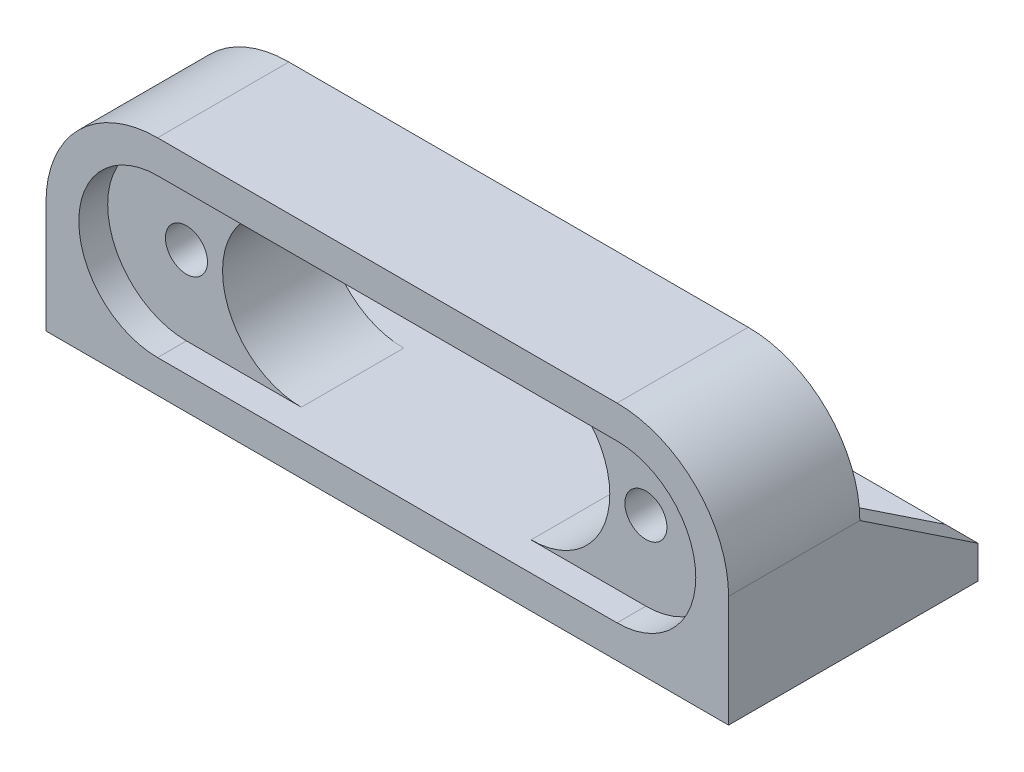
ISO-10303-21;
HEADER;
FILE_DESCRIPTION(('STEP AP214'),'2;1');
FILE_NAME('part.step','',(''),(''),'','','');
FILE_SCHEMA(('AUTOMOTIVE_DESIGN { 1 0 10303 214 1 1 1 1 }'));
ENDSEC;
DATA;
#1=APPLICATION_CONTEXT('core data for automotive mechanical design processes');
#2=APPLICATION_PROTOCOL_DEFINITION('international standard','automotive_design',2000,#1);
#3=PRODUCT_CONTEXT('',#1,'mechanical');
#4=PRODUCT('Part','Part','',(#3));
#5=PRODUCT_RELATED_PRODUCT_CATEGORY('part','',(#4));
#6=PRODUCT_DEFINITION_FORMATION('','',#4);
#7=PRODUCT_DEFINITION_CONTEXT('part definition',#1,'design');
#8=PRODUCT_DEFINITION('design','',#6,#7);
#9=PRODUCT_DEFINITION_SHAPE('','',#8);
#10=(LENGTH_UNIT() NAMED_UNIT(*) SI_UNIT(.MILLI.,.METRE.));
#11=(NAMED_UNIT(*) PLANE_ANGLE_UNIT() SI_UNIT($,.RADIAN.));
#12=(NAMED_UNIT(*) SI_UNIT($,.STERADIAN.) SOLID_ANGLE_UNIT());
#13=UNCERTAINTY_MEASURE_WITH_UNIT(LENGTH_MEASURE(1.E-05),#10,'distance_accuracy_value','');
#14=(GEOMETRIC_REPRESENTATION_CONTEXT(3) GLOBAL_UNCERTAINTY_ASSIGNED_CONTEXT((#13)) GLOBAL_UNIT_ASSIGNED_CONTEXT((#10,
#11,#12)) REPRESENTATION_CONTEXT('',''));
#15=CARTESIAN_POINT('',(0.,0.,0.));
#16=DIRECTION('',(0.,0.,1.));
#17=DIRECTION('',(1.,0.,0.));
#18=AXIS2_PLACEMENT_3D('',#15,#16,#17);
#19=CARTESIAN_POINT('',(-17.5,0.,0.));
#20=DIRECTION('',(0.,0.,1.));
#21=DIRECTION('',(1.,0.,0.));
#22=AXIS2_PLACEMENT_3D('',#19,#20,#21);
#23=PLANE('',#22);
#24=CARTESIAN_POINT('',(17.5,0.,0.));
#25=DIRECTION('',(0.,0.,1.));
#26=DIRECTION('',(1.,0.,0.));
#27=AXIS2_PLACEMENT_3D('',#24,#25,#26);
#28=CIRCLE('',#27,1.6);
#29=CARTESIAN_POINT('',(19.1,0.,0.));
#30=VERTEX_POINT('',#29);
#31=EDGE_CURVE('E260',#30,#30,#28,.T.);
#32=ORIENTED_EDGE('',*,*,#31,.T.);
#33=EDGE_LOOP('',(#32));
#34=FACE_BOUND('',#33,.T.);
#35=CARTESIAN_POINT('',(-17.5,0.,0.));
#36=DIRECTION('',(0.,0.,1.));
#37=DIRECTION('',(1.,0.,0.));
#38=AXIS2_PLACEMENT_3D('',#35,#36,#37);
#39=CIRCLE('',#38,1.6);
#40=CARTESIAN_POINT('',(-15.9,0.,0.));
#41=VERTEX_POINT('',#40);
#42=EDGE_CURVE('E256',#41,#41,#39,.T.);
#43=ORIENTED_EDGE('',*,*,#42,.T.);
#44=EDGE_LOOP('',(#43));
#45=FACE_BOUND('',#44,.T.);
#46=DIRECTION('',(1.,0.,0.));
#47=VECTOR('',#46,1.);
#48=CARTESIAN_POINT('',(26.,0.,0.));
#49=LINE('',#48,#47);
#50=CARTESIAN_POINT('',(23.5,0.,0.));
#51=VERTEX_POINT('',#50);
#52=CARTESIAN_POINT('',(26.,0.,0.));
#53=VERTEX_POINT('',#52);
#54=EDGE_CURVE('E189',#51,#53,#49,.T.);
#55=ORIENTED_EDGE('',*,*,#54,.F.);
#56=DIRECTION('',(0.,1.,0.));
#57=VECTOR('',#56,1.);
#58=CARTESIAN_POINT('',(23.5,0.,0.));
#59=LINE('',#58,#57);
#60=CARTESIAN_POINT('',(23.5,-6.,0.));
#61=VERTEX_POINT('',#60);
#62=EDGE_CURVE('E354',#61,#51,#59,.T.);
#63=ORIENTED_EDGE('',*,*,#62,.F.);
#64=DIRECTION('',(1.,0.,0.));
#65=VECTOR('',#64,1.);
#66=CARTESIAN_POINT('',(8.74999999999994,-6.,0.));
#67=LINE('',#66,#65);
#68=CARTESIAN_POINT('',(8.75,-6.,0.));
#69=VERTEX_POINT('',#68);
#70=EDGE_CURVE('E52',#69,#61,#67,.T.);
#71=ORIENTED_EDGE('',*,*,#70,.F.);
#72=CARTESIAN_POINT('',(8.75,0.,0.));
#73=DIRECTION('',(0.,0.,1.));
#74=DIRECTION('',(1.,0.,0.));
#75=AXIS2_PLACEMENT_3D('',#72,#73,#74);
#76=CIRCLE('',#75,6.);
#77=CARTESIAN_POINT('',(8.75,6.,0.));
#78=VERTEX_POINT('',#77);
#79=EDGE_CURVE('E275',#69,#78,#76,.T.);
#80=ORIENTED_EDGE('',*,*,#79,.T.);
#81=DIRECTION('',(-1.,0.,0.));
#82=VECTOR('',#81,1.);
#83=CARTESIAN_POINT('',(0.,6.,0.));
#84=LINE('',#83,#82);
#85=CARTESIAN_POINT('',(-8.75,6.,0.));
#86=VERTEX_POINT('',#85);
#87=EDGE_CURVE('E269',#78,#86,#84,.T.);
#88=ORIENTED_EDGE('',*,*,#87,.T.);
#89=CARTESIAN_POINT('',(-8.75,0.,0.));
#90=DIRECTION('',(0.,0.,1.));
#91=DIRECTION('',(1.,0.,0.));
#92=AXIS2_PLACEMENT_3D('',#89,#90,#91);
#93=CIRCLE('',#92,6.);
#94=CARTESIAN_POINT('',(-8.75,-6.,0.));
#95=VERTEX_POINT('',#94);
#96=EDGE_CURVE('E264',#86,#95,#93,.T.);
#97=ORIENTED_EDGE('',*,*,#96,.T.);
#98=CARTESIAN_POINT('',(-23.5,-6.,0.));
#99=VERTEX_POINT('',#98);
#100=EDGE_CURVE('E66',#99,#95,#67,.T.);
#101=ORIENTED_EDGE('',*,*,#100,.F.);
#102=DIRECTION('',(0.,-1.,0.));
#103=VECTOR('',#102,1.);
#104=CARTESIAN_POINT('',(-23.5,0.,0.));
#105=LINE('',#104,#103);
#106=CARTESIAN_POINT('',(-23.5,0.,0.));
#107=VERTEX_POINT('',#106);
#108=EDGE_CURVE('E187',#107,#99,#105,.T.);
#109=ORIENTED_EDGE('',*,*,#108,.F.);
#110=DIRECTION('',(1.,0.,0.));
#111=VECTOR('',#110,1.);
#112=CARTESIAN_POINT('',(-26.,0.,0.));
#113=LINE('',#112,#111);
#114=CARTESIAN_POINT('',(-26.,0.,0.));
#115=VERTEX_POINT('',#114);
#116=EDGE_CURVE('E171',#115,#107,#113,.T.);
#117=ORIENTED_EDGE('',*,*,#116,.F.);
#118=CARTESIAN_POINT('',(-17.5,0.,0.));
#119=DIRECTION('',(0.,0.,1.));
#120=DIRECTION('',(1.,0.,0.));
#121=AXIS2_PLACEMENT_3D('',#118,#119,#120);
#122=CIRCLE('',#121,8.5);
#123=CARTESIAN_POINT('',(-17.5,8.5,0.));
#124=VERTEX_POINT('',#123);
#125=EDGE_CURVE('E185',#124,#115,#122,.T.);
#126=ORIENTED_EDGE('',*,*,#125,.F.);
#127=DIRECTION('',(-1.,0.,0.));
#128=VECTOR('',#127,1.);
#129=CARTESIAN_POINT('',(0.,8.5,0.));
#130=LINE('',#129,#128);
#131=CARTESIAN_POINT('',(17.5,8.5,0.));
#132=VERTEX_POINT('',#131);
#133=EDGE_CURVE('E299',#132,#124,#130,.T.);
#134=ORIENTED_EDGE('',*,*,#133,.F.);
#135=CARTESIAN_POINT('',(17.5,0.,0.));
#136=DIRECTION('',(0.,0.,1.));
#137=DIRECTION('',(1.,0.,0.));
#138=AXIS2_PLACEMENT_3D('',#135,#136,#137);
#139=CIRCLE('',#138,8.5);
#140=EDGE_CURVE('E198',#53,#132,#139,.T.);
#141=ORIENTED_EDGE('',*,*,#140,.F.);
#142=EDGE_LOOP('',(#55,#63,#71,#80,#88,#97,#101,#109,#117,#126,#134,#141));
#143=FACE_BOUND('',#142,.T.);
#144=ADVANCED_FACE('F43',(#34,#45,#143),#23,.F.);
#145=CARTESIAN_POINT('',(-8.75,0.,10.));
#146=DIRECTION('',(0.,0.,-1.));
#147=DIRECTION('',(-1.,0.,0.));
#148=AXIS2_PLACEMENT_3D('',#145,#146,#147);
#149=CYLINDRICAL_SURFACE('',#148,6.);
#150=DIRECTION('',(0.,0.,-1.));
#151=VECTOR('',#150,1.);
#152=CARTESIAN_POINT('',(-8.75,6.,10.));
#153=LINE('',#152,#151);
#154=CARTESIAN_POINT('',(-8.75,6.,7.8));
#155=VERTEX_POINT('',#154);
#156=EDGE_CURVE('E199',#155,#86,#153,.T.);
#157=ORIENTED_EDGE('',*,*,#156,.F.);
#158=CARTESIAN_POINT('',(-8.75,0.,7.8));
#159=DIRECTION('',(0.,0.,1.));
#160=DIRECTION('',(1.,0.,0.));
#161=AXIS2_PLACEMENT_3D('',#158,#159,#160);
#162=CIRCLE('',#161,6.);
#163=CARTESIAN_POINT('',(-8.75,-6.,7.8));
#164=VERTEX_POINT('',#163);
#165=EDGE_CURVE('E252',#155,#164,#162,.T.);
#166=ORIENTED_EDGE('',*,*,#165,.T.);
#167=DIRECTION('',(0.,0.,-1.));
#168=VECTOR('',#167,1.);
#169=CARTESIAN_POINT('',(-8.75,-6.,10.));
#170=LINE('',#169,#168);
#171=EDGE_CURVE('E288',#164,#95,#170,.T.);
#172=ORIENTED_EDGE('',*,*,#171,.T.);
#173=ORIENTED_EDGE('',*,*,#96,.F.);
#174=EDGE_LOOP('',(#157,#166,#172,#173));
#175=FACE_BOUND('',#174,.T.);
#176=ADVANCED_FACE('F467',(#175),#149,.F.);
#177=CARTESIAN_POINT('',(8.75,0.,10.));
#178=DIRECTION('',(0.,0.,-1.));
#179=DIRECTION('',(-1.,0.,0.));
#180=AXIS2_PLACEMENT_3D('',#177,#178,#179);
#181=CYLINDRICAL_SURFACE('',#180,6.);
#182=DIRECTION('',(0.,0.,-1.));
#183=VECTOR('',#182,1.);
#184=CARTESIAN_POINT('',(8.75,-6.,10.));
#185=LINE('',#184,#183);
#186=CARTESIAN_POINT('',(8.75,-6.,7.8));
#187=VERTEX_POINT('',#186);
#188=EDGE_CURVE('E284',#187,#69,#185,.T.);
#189=ORIENTED_EDGE('',*,*,#188,.F.);
#190=CARTESIAN_POINT('',(8.75,0.,7.8));
#191=DIRECTION('',(0.,0.,1.));
#192=DIRECTION('',(1.,0.,0.));
#193=AXIS2_PLACEMENT_3D('',#190,#191,#192);
#194=CIRCLE('',#193,6.);
#195=CARTESIAN_POINT('',(8.75,6.,7.8));
#196=VERTEX_POINT('',#195);
#197=EDGE_CURVE('E223',#187,#196,#194,.T.);
#198=ORIENTED_EDGE('',*,*,#197,.T.);
#199=DIRECTION('',(0.,0.,-1.));
#200=VECTOR('',#199,1.);
#201=CARTESIAN_POINT('',(8.75,6.,10.));
#202=LINE('',#201,#200);
#203=EDGE_CURVE('E272',#196,#78,#202,.T.);
#204=ORIENTED_EDGE('',*,*,#203,.T.);
#205=ORIENTED_EDGE('',*,*,#79,.F.);
#206=EDGE_LOOP('',(#189,#198,#204,#205));
#207=FACE_BOUND('',#206,.T.);
#208=ADVANCED_FACE('F418',(#207),#181,.F.);
#209=CARTESIAN_POINT('',(17.5,0.,10.));
#210=DIRECTION('',(0.,0.,-1.));
#211=DIRECTION('',(-1.,0.,0.));
#212=AXIS2_PLACEMENT_3D('',#209,#210,#211);
#213=CYLINDRICAL_SURFACE('',#212,1.6);
#214=ORIENTED_EDGE('',*,*,#31,.F.);
#215=EDGE_LOOP('',(#214));
#216=FACE_BOUND('',#215,.T.);
#217=CARTESIAN_POINT('',(17.5,0.,7.8));
#218=DIRECTION('',(0.,0.,1.));
#219=DIRECTION('',(1.,0.,0.));
#220=AXIS2_PLACEMENT_3D('',#217,#218,#219);
#221=CIRCLE('',#220,1.6);
#222=CARTESIAN_POINT('',(19.1,0.,7.8));
#223=VERTEX_POINT('',#222);
#224=EDGE_CURVE('E216',#223,#223,#221,.T.);
#225=ORIENTED_EDGE('',*,*,#224,.T.);
#226=EDGE_LOOP('',(#225));
#227=FACE_BOUND('',#226,.T.);
#228=ADVANCED_FACE('F501',(#216,#227),#213,.F.);
#229=CARTESIAN_POINT('',(-17.5,0.,10.));
#230=DIRECTION('',(0.,0.,-1.));
#231=DIRECTION('',(-1.,0.,0.));
#232=AXIS2_PLACEMENT_3D('',#229,#230,#231);
#233=CYLINDRICAL_SURFACE('',#232,1.6);
#234=ORIENTED_EDGE('',*,*,#42,.F.);
#235=EDGE_LOOP('',(#234));
#236=FACE_BOUND('',#235,.T.);
#237=CARTESIAN_POINT('',(-17.5,0.,7.8));
#238=DIRECTION('',(0.,0.,1.));
#239=DIRECTION('',(1.,0.,0.));
#240=AXIS2_PLACEMENT_3D('',#237,#238,#239);
#241=CIRCLE('',#240,1.6);
#242=CARTESIAN_POINT('',(-15.9,0.,7.8));
#243=VERTEX_POINT('',#242);
#244=EDGE_CURVE('E213',#243,#243,#241,.T.);
#245=ORIENTED_EDGE('',*,*,#244,.T.);
#246=EDGE_LOOP('',(#245));
#247=FACE_BOUND('',#246,.T.);
#248=ADVANCED_FACE('F497',(#236,#247),#233,.F.);
#249=CARTESIAN_POINT('',(-17.5,0.,10.));
#250=DIRECTION('',(0.,0.,1.));
#251=DIRECTION('',(1.,0.,0.));
#252=AXIS2_PLACEMENT_3D('',#249,#250,#251);
#253=PLANE('',#252);
#254=CARTESIAN_POINT('',(17.5,0.,10.));
#255=DIRECTION('',(0.,0.,1.));
#256=DIRECTION('',(1.,0.,0.));
#257=AXIS2_PLACEMENT_3D('',#254,#255,#256);
#258=CIRCLE('',#257,6.);
#259=CARTESIAN_POINT('',(17.5,-6.,10.));
#260=VERTEX_POINT('',#259);
#261=CARTESIAN_POINT('',(17.5,6.,10.));
#262=VERTEX_POINT('',#261);
#263=EDGE_CURVE('E370',#260,#262,#258,.T.);
#264=ORIENTED_EDGE('',*,*,#263,.F.);
#265=DIRECTION('',(1.,0.,0.));
#266=VECTOR('',#265,1.);
#267=CARTESIAN_POINT('',(0.,-6.,10.));
#268=LINE('',#267,#266);
#269=CARTESIAN_POINT('',(-17.5,-6.,10.));
#270=VERTEX_POINT('',#269);
#271=EDGE_CURVE('E268',#270,#260,#268,.T.);
#272=ORIENTED_EDGE('',*,*,#271,.F.);
#273=CARTESIAN_POINT('',(-17.5,0.,10.));
#274=DIRECTION('',(0.,0.,1.));
#275=DIRECTION('',(1.,0.,0.));
#276=AXIS2_PLACEMENT_3D('',#273,#274,#275);
#277=CIRCLE('',#276,6.);
#278=CARTESIAN_POINT('',(-17.5,6.,10.));
#279=VERTEX_POINT('',#278);
#280=EDGE_CURVE('E238',#279,#270,#277,.T.);
#281=ORIENTED_EDGE('',*,*,#280,.F.);
#282=DIRECTION('',(-1.,0.,0.));
#283=VECTOR('',#282,1.);
#284=CARTESIAN_POINT('',(0.,6.,10.));
#285=LINE('',#284,#283);
#286=EDGE_CURVE('E265',#262,#279,#285,.T.);
#287=ORIENTED_EDGE('',*,*,#286,.F.);
#288=EDGE_LOOP('',(#264,#272,#281,#287));
#289=FACE_BOUND('',#288,.T.);
#290=DIRECTION('',(-1.,0.,0.));
#291=VECTOR('',#290,1.);
#292=CARTESIAN_POINT('',(0.,8.5,10.));
#293=LINE('',#292,#291);
#294=CARTESIAN_POINT('',(17.5,8.5,10.));
#295=VERTEX_POINT('',#294);
#296=CARTESIAN_POINT('',(-17.5,8.5,10.));
#297=VERTEX_POINT('',#296);
#298=EDGE_CURVE('E294',#295,#297,#293,.T.);
#299=ORIENTED_EDGE('',*,*,#298,.T.);
#300=CARTESIAN_POINT('',(-17.5,0.,10.));
#301=DIRECTION('',(0.,0.,1.));
#302=DIRECTION('',(1.,0.,0.));
#303=AXIS2_PLACEMENT_3D('',#300,#301,#302);
#304=CIRCLE('',#303,8.5);
#305=CARTESIAN_POINT('',(-26.,0.,10.));
#306=VERTEX_POINT('',#305);
#307=EDGE_CURVE('E298',#297,#306,#304,.T.);
#308=ORIENTED_EDGE('',*,*,#307,.T.);
#309=DIRECTION('',(0.,-1.,0.));
#310=VECTOR('',#309,1.);
#311=CARTESIAN_POINT('',(-26.,0.,10.));
#312=LINE('',#311,#310);
#313=CARTESIAN_POINT('',(-26.,-8.5,10.));
#314=VERTEX_POINT('',#313);
#315=EDGE_CURVE('E203',#306,#314,#312,.T.);
#316=ORIENTED_EDGE('',*,*,#315,.T.);
#317=DIRECTION('',(1.,0.,0.));
#318=VECTOR('',#317,1.);
#319=CARTESIAN_POINT('',(-17.5,-8.5,10.));
#320=LINE('',#319,#318);
#321=CARTESIAN_POINT('',(26.,-8.5,10.));
#322=VERTEX_POINT('',#321);
#323=EDGE_CURVE('E304',#314,#322,#320,.T.);
#324=ORIENTED_EDGE('',*,*,#323,.T.);
#325=DIRECTION('',(0.,1.,0.));
#326=VECTOR('',#325,1.);
#327=CARTESIAN_POINT('',(26.,0.,10.));
#328=LINE('',#327,#326);
#329=CARTESIAN_POINT('',(26.,0.,10.));
#330=VERTEX_POINT('',#329);
#331=EDGE_CURVE('E307',#322,#330,#328,.T.);
#332=ORIENTED_EDGE('',*,*,#331,.T.);
#333=CARTESIAN_POINT('',(17.5,0.,10.));
#334=DIRECTION('',(0.,0.,1.));
#335=DIRECTION('',(1.,0.,0.));
#336=AXIS2_PLACEMENT_3D('',#333,#334,#335);
#337=CIRCLE('',#336,8.5);
#338=EDGE_CURVE('E310',#330,#295,#337,.T.);
#339=ORIENTED_EDGE('',*,*,#338,.T.);
#340=EDGE_LOOP('',(#299,#308,#316,#324,#332,#339));
#341=FACE_BOUND('',#340,.T.);
#342=ADVANCED_FACE('F395',(#289,#341),#253,.T.);
#343=CARTESIAN_POINT('',(-17.5,0.,10.));
#344=DIRECTION('',(0.,0.,-1.));
#345=DIRECTION('',(-1.,0.,0.));
#346=AXIS2_PLACEMENT_3D('',#343,#344,#345);
#347=CYLINDRICAL_SURFACE('',#346,8.5);
#348=ORIENTED_EDGE('',*,*,#125,.T.);
#349=DIRECTION('',(0.,0.,-1.));
#350=VECTOR('',#349,1.);
#351=CARTESIAN_POINT('',(-26.,0.,10.));
#352=LINE('',#351,#350);
#353=EDGE_CURVE('E193',#306,#115,#352,.T.);
#354=ORIENTED_EDGE('',*,*,#353,.F.);
#355=ORIENTED_EDGE('',*,*,#307,.F.);
#356=DIRECTION('',(0.,0.,-1.));
#357=VECTOR('',#356,1.);
#358=CARTESIAN_POINT('',(-17.5,8.5,10.));
#359=LINE('',#358,#357);
#360=EDGE_CURVE('E196',#297,#124,#359,.T.);
#361=ORIENTED_EDGE('',*,*,#360,.T.);
#362=EDGE_LOOP('',(#348,#354,#355,#361));
#363=FACE_BOUND('',#362,.T.);
#364=ADVANCED_FACE('F45',(#363),#347,.T.);
#365=CARTESIAN_POINT('',(-26.,0.,10.));
#366=DIRECTION('',(1.,0.,0.));
#367=DIRECTION('',(0.,0.,-1.));
#368=AXIS2_PLACEMENT_3D('',#365,#366,#367);
#369=PLANE('',#368);
#370=ORIENTED_EDGE('',*,*,#353,.T.);
#371=DIRECTION('',(0.,-0.554700196225229,-0.832050294337844));
#372=VECTOR('',#371,1.);
#373=CARTESIAN_POINT('',(-26.,-6.,-9.));
#374=LINE('',#373,#372);
#375=CARTESIAN_POINT('',(-26.,-6.,-9.));
#376=VERTEX_POINT('',#375);
#377=EDGE_CURVE('E168',#115,#376,#374,.T.);
#378=ORIENTED_EDGE('',*,*,#377,.T.);
#379=DIRECTION('',(0.,1.,0.));
#380=VECTOR('',#379,1.);
#381=CARTESIAN_POINT('',(-26.,0.,-9.));
#382=LINE('',#381,#380);
#383=CARTESIAN_POINT('',(-26.,-8.5,-9.));
#384=VERTEX_POINT('',#383);
#385=EDGE_CURVE('E342',#384,#376,#382,.T.);
#386=ORIENTED_EDGE('',*,*,#385,.F.);
#387=DIRECTION('',(0.,0.,-1.));
#388=VECTOR('',#387,1.);
#389=CARTESIAN_POINT('',(-26.,-8.5,10.));
#390=LINE('',#389,#388);
#391=EDGE_CURVE('E205',#314,#384,#390,.T.);
#392=ORIENTED_EDGE('',*,*,#391,.F.);
#393=ORIENTED_EDGE('',*,*,#315,.F.);
#394=EDGE_LOOP('',(#370,#378,#386,#392,#393));
#395=FACE_BOUND('',#394,.T.);
#396=ADVANCED_FACE('F201',(#395),#369,.F.);
#397=CARTESIAN_POINT('',(17.5,-8.5,10.));
#398=DIRECTION('',(0.,1.,0.));
#399=DIRECTION('',(0.,0.,1.));
#400=AXIS2_PLACEMENT_3D('',#397,#398,#399);
#401=PLANE('',#400);
#402=CARTESIAN_POINT('',(-16.55,-8.5,-4.5));
#403=DIRECTION('',(0.,1.,0.));
#404=DIRECTION('',(0.,0.,1.));
#405=AXIS2_PLACEMENT_3D('',#402,#403,#404);
#406=CIRCLE('',#405,1.6);
#407=CARTESIAN_POINT('',(-16.55,-8.5,-2.9));
#408=VERTEX_POINT('',#407);
#409=EDGE_CURVE('E355',#408,#408,#406,.T.);
#410=ORIENTED_EDGE('',*,*,#409,.T.);
#411=EDGE_LOOP('',(#410));
#412=FACE_BOUND('',#411,.T.);
#413=CARTESIAN_POINT('',(16.55,-8.5,-4.5));
#414=DIRECTION('',(0.,1.,0.));
#415=DIRECTION('',(0.,0.,1.));
#416=AXIS2_PLACEMENT_3D('',#413,#414,#415);
#417=CIRCLE('',#416,1.6);
#418=CARTESIAN_POINT('',(16.55,-8.5,-2.9));
#419=VERTEX_POINT('',#418);
#420=EDGE_CURVE('E439',#419,#419,#417,.T.);
#421=ORIENTED_EDGE('',*,*,#420,.T.);
#422=EDGE_LOOP('',(#421));
#423=FACE_BOUND('',#422,.T.);
#424=ORIENTED_EDGE('',*,*,#391,.T.);
#425=DIRECTION('',(-1.,0.,0.));
#426=VECTOR('',#425,1.);
#427=CARTESIAN_POINT('',(26.,-8.5,-9.));
#428=LINE('',#427,#426);
#429=CARTESIAN_POINT('',(26.,-8.5,-9.));
#430=VERTEX_POINT('',#429);
#431=EDGE_CURVE('E338',#430,#384,#428,.T.);
#432=ORIENTED_EDGE('',*,*,#431,.F.);
#433=DIRECTION('',(0.,0.,-1.));
#434=VECTOR('',#433,1.);
#435=CARTESIAN_POINT('',(26.,-8.5,10.));
#436=LINE('',#435,#434);
#437=EDGE_CURVE('E210',#322,#430,#436,.T.);
#438=ORIENTED_EDGE('',*,*,#437,.F.);
#439=ORIENTED_EDGE('',*,*,#323,.F.);
#440=EDGE_LOOP('',(#424,#432,#438,#439));
#441=FACE_BOUND('',#440,.T.);
#442=ADVANCED_FACE('F339',(#412,#423,#441),#401,.F.);
#443=CARTESIAN_POINT('',(26.,0.,10.));
#444=DIRECTION('',(-1.,0.,0.));
#445=DIRECTION('',(0.,0.,1.));
#446=AXIS2_PLACEMENT_3D('',#443,#444,#445);
#447=PLANE('',#446);
#448=DIRECTION('',(0.,-1.,0.));
#449=VECTOR('',#448,1.);
#450=CARTESIAN_POINT('',(26.,0.,-9.));
#451=LINE('',#450,#449);
#452=CARTESIAN_POINT('',(26.,-6.,-9.));
#453=VERTEX_POINT('',#452);
#454=EDGE_CURVE('E333',#453,#430,#451,.T.);
#455=ORIENTED_EDGE('',*,*,#454,.F.);
#456=DIRECTION('',(0.,-0.554700196225229,-0.832050294337844));
#457=VECTOR('',#456,1.);
#458=CARTESIAN_POINT('',(26.,-6.,-9.));
#459=LINE('',#458,#457);
#460=EDGE_CURVE('E59',#53,#453,#459,.T.);
#461=ORIENTED_EDGE('',*,*,#460,.F.);
#462=DIRECTION('',(0.,0.,-1.));
#463=VECTOR('',#462,1.);
#464=CARTESIAN_POINT('',(26.,0.,10.));
#465=LINE('',#464,#463);
#466=EDGE_CURVE('E322',#330,#53,#465,.T.);
#467=ORIENTED_EDGE('',*,*,#466,.F.);
#468=ORIENTED_EDGE('',*,*,#331,.F.);
#469=ORIENTED_EDGE('',*,*,#437,.T.);
#470=EDGE_LOOP('',(#455,#461,#467,#468,#469));
#471=FACE_BOUND('',#470,.T.);
#472=ADVANCED_FACE('F332',(#471),#447,.F.);
#473=CARTESIAN_POINT('',(17.5,0.,10.));
#474=DIRECTION('',(0.,0.,-1.));
#475=DIRECTION('',(-1.,0.,0.));
#476=AXIS2_PLACEMENT_3D('',#473,#474,#475);
#477=CYLINDRICAL_SURFACE('',#476,8.5);
#478=ORIENTED_EDGE('',*,*,#140,.T.);
#479=DIRECTION('',(0.,0.,-1.));
#480=VECTOR('',#479,1.);
#481=CARTESIAN_POINT('',(17.5,8.5,10.));
#482=LINE('',#481,#480);
#483=EDGE_CURVE('E313',#295,#132,#482,.T.);
#484=ORIENTED_EDGE('',*,*,#483,.F.);
#485=ORIENTED_EDGE('',*,*,#338,.F.);
#486=ORIENTED_EDGE('',*,*,#466,.T.);
#487=EDGE_LOOP('',(#478,#484,#485,#486));
#488=FACE_BOUND('',#487,.T.);
#489=ADVANCED_FACE('F481',(#488),#477,.T.);
#490=CARTESIAN_POINT('',(0.,8.5,10.));
#491=DIRECTION('',(0.,-1.,0.));
#492=DIRECTION('',(0.,0.,-1.));
#493=AXIS2_PLACEMENT_3D('',#490,#491,#492);
#494=PLANE('',#493);
#495=ORIENTED_EDGE('',*,*,#133,.T.);
#496=ORIENTED_EDGE('',*,*,#360,.F.);
#497=ORIENTED_EDGE('',*,*,#298,.F.);
#498=ORIENTED_EDGE('',*,*,#483,.T.);
#499=EDGE_LOOP('',(#495,#496,#497,#498));
#500=FACE_BOUND('',#499,.T.);
#501=ADVANCED_FACE('F478',(#500),#494,.F.);
#502=CARTESIAN_POINT('',(0.,-6.,10.));
#503=DIRECTION('',(0.,1.,0.));
#504=DIRECTION('',(0.,0.,1.));
#505=AXIS2_PLACEMENT_3D('',#502,#503,#504);
#506=PLANE('',#505);
#507=CARTESIAN_POINT('',(-16.55,-6.,-4.5));
#508=DIRECTION('',(0.,1.,0.));
#509=DIRECTION('',(0.,0.,1.));
#510=AXIS2_PLACEMENT_3D('',#507,#508,#509);
#511=CIRCLE('',#510,1.6);
#512=CARTESIAN_POINT('',(-16.55,-6.,-2.9));
#513=VERTEX_POINT('',#512);
#514=EDGE_CURVE('E443',#513,#513,#511,.T.);
#515=ORIENTED_EDGE('',*,*,#514,.F.);
#516=EDGE_LOOP('',(#515));
#517=FACE_BOUND('',#516,.T.);
#518=CARTESIAN_POINT('',(16.55,-6.,-4.5));
#519=DIRECTION('',(0.,1.,0.));
#520=DIRECTION('',(0.,0.,1.));
#521=AXIS2_PLACEMENT_3D('',#518,#519,#520);
#522=CIRCLE('',#521,1.6);
#523=CARTESIAN_POINT('',(16.55,-6.,-2.9));
#524=VERTEX_POINT('',#523);
#525=EDGE_CURVE('E429',#524,#524,#522,.T.);
#526=ORIENTED_EDGE('',*,*,#525,.F.);
#527=EDGE_LOOP('',(#526));
#528=FACE_BOUND('',#527,.T.);
#529=DIRECTION('',(1.,0.,0.));
#530=VECTOR('',#529,1.);
#531=CARTESIAN_POINT('',(0.,-6.,7.8));
#532=LINE('',#531,#530);
#533=CARTESIAN_POINT('',(17.5,-6.,7.8));
#534=VERTEX_POINT('',#533);
#535=EDGE_CURVE('E383',#187,#534,#532,.T.);
#536=ORIENTED_EDGE('',*,*,#535,.F.);
#537=ORIENTED_EDGE('',*,*,#188,.T.);
#538=ORIENTED_EDGE('',*,*,#70,.T.);
#539=DIRECTION('',(0.,0.,1.));
#540=VECTOR('',#539,1.);
#541=CARTESIAN_POINT('',(23.5,-6.,-9.));
#542=LINE('',#541,#540);
#543=CARTESIAN_POINT('',(23.5,-6.,-9.));
#544=VERTEX_POINT('',#543);
#545=EDGE_CURVE('E366',#544,#61,#542,.T.);
#546=ORIENTED_EDGE('',*,*,#545,.F.);
#547=DIRECTION('',(1.,0.,0.));
#548=VECTOR('',#547,1.);
#549=CARTESIAN_POINT('',(8.74999999999994,-6.,-9.));
#550=LINE('',#549,#548);
#551=CARTESIAN_POINT('',(-23.5,-6.,-9.));
#552=VERTEX_POINT('',#551);
#553=EDGE_CURVE('E348',#552,#544,#550,.T.);
#554=ORIENTED_EDGE('',*,*,#553,.F.);
#555=DIRECTION('',(0.,0.,1.));
#556=VECTOR('',#555,1.);
#557=CARTESIAN_POINT('',(-23.5,-6.,-9.));
#558=LINE('',#557,#556);
#559=EDGE_CURVE('E346',#552,#99,#558,.T.);
#560=ORIENTED_EDGE('',*,*,#559,.T.);
#561=ORIENTED_EDGE('',*,*,#100,.T.);
#562=ORIENTED_EDGE('',*,*,#171,.F.);
#563=CARTESIAN_POINT('',(-17.5,-6.,7.8));
#564=VERTEX_POINT('',#563);
#565=EDGE_CURVE('E247',#564,#164,#532,.T.);
#566=ORIENTED_EDGE('',*,*,#565,.F.);
#567=DIRECTION('',(0.,0.,1.));
#568=VECTOR('',#567,1.);
#569=CARTESIAN_POINT('',(-17.5,-6.,7.8));
#570=LINE('',#569,#568);
#571=EDGE_CURVE('E226',#564,#270,#570,.T.);
#572=ORIENTED_EDGE('',*,*,#571,.T.);
#573=ORIENTED_EDGE('',*,*,#271,.T.);
#574=DIRECTION('',(0.,0.,1.));
#575=VECTOR('',#574,1.);
#576=CARTESIAN_POINT('',(17.5,-6.,7.8));
#577=LINE('',#576,#575);
#578=EDGE_CURVE('E217',#534,#260,#577,.T.);
#579=ORIENTED_EDGE('',*,*,#578,.F.);
#580=EDGE_LOOP('',(#536,#537,#538,#546,#554,#560,#561,#562,#566,#572,#573,#579));
#581=FACE_BOUND('',#580,.T.);
#582=ADVANCED_FACE('F399',(#517,#528,#581),#506,.T.);
#583=CARTESIAN_POINT('',(0.,6.,10.));
#584=DIRECTION('',(0.,-1.,0.));
#585=DIRECTION('',(0.,0.,-1.));
#586=AXIS2_PLACEMENT_3D('',#583,#584,#585);
#587=PLANE('',#586);
#588=ORIENTED_EDGE('',*,*,#286,.T.);
#589=DIRECTION('',(0.,0.,1.));
#590=VECTOR('',#589,1.);
#591=CARTESIAN_POINT('',(-17.5,6.,7.8));
#592=LINE('',#591,#590);
#593=CARTESIAN_POINT('',(-17.5,6.,7.8));
#594=VERTEX_POINT('',#593);
#595=EDGE_CURVE('E235',#594,#279,#592,.T.);
#596=ORIENTED_EDGE('',*,*,#595,.F.);
#597=DIRECTION('',(-1.,0.,0.));
#598=VECTOR('',#597,1.);
#599=CARTESIAN_POINT('',(0.,6.,7.8));
#600=LINE('',#599,#598);
#601=EDGE_CURVE('E375',#155,#594,#600,.T.);
#602=ORIENTED_EDGE('',*,*,#601,.F.);
#603=ORIENTED_EDGE('',*,*,#156,.T.);
#604=ORIENTED_EDGE('',*,*,#87,.F.);
#605=ORIENTED_EDGE('',*,*,#203,.F.);
#606=CARTESIAN_POINT('',(17.5,6.,7.8));
#607=VERTEX_POINT('',#606);
#608=EDGE_CURVE('E376',#607,#196,#600,.T.);
#609=ORIENTED_EDGE('',*,*,#608,.F.);
#610=DIRECTION('',(0.,0.,1.));
#611=VECTOR('',#610,1.);
#612=CARTESIAN_POINT('',(17.5,6.,7.8));
#613=LINE('',#612,#611);
#614=EDGE_CURVE('E244',#607,#262,#613,.T.);
#615=ORIENTED_EDGE('',*,*,#614,.T.);
#616=EDGE_LOOP('',(#588,#596,#602,#603,#604,#605,#609,#615));
#617=FACE_BOUND('',#616,.T.);
#618=ADVANCED_FACE('F407',(#617),#587,.T.);
#619=CARTESIAN_POINT('',(17.5,0.,7.8));
#620=DIRECTION('',(0.,0.,1.));
#621=DIRECTION('',(1.,0.,0.));
#622=AXIS2_PLACEMENT_3D('',#619,#620,#621);
#623=PLANE('',#622);
#624=ORIENTED_EDGE('',*,*,#244,.F.);
#625=EDGE_LOOP('',(#624));
#626=FACE_BOUND('',#625,.T.);
#627=ORIENTED_EDGE('',*,*,#601,.T.);
#628=CARTESIAN_POINT('',(-17.5,0.,7.8));
#629=DIRECTION('',(0.,0.,1.));
#630=DIRECTION('',(1.,0.,0.));
#631=AXIS2_PLACEMENT_3D('',#628,#629,#630);
#632=CIRCLE('',#631,6.);
#633=EDGE_CURVE('E379',#594,#564,#632,.T.);
#634=ORIENTED_EDGE('',*,*,#633,.T.);
#635=ORIENTED_EDGE('',*,*,#565,.T.);
#636=ORIENTED_EDGE('',*,*,#165,.F.);
#637=EDGE_LOOP('',(#627,#634,#635,#636));
#638=FACE_BOUND('',#637,.T.);
#639=ADVANCED_FACE('F402',(#626,#638),#623,.T.);
#640=CARTESIAN_POINT('',(-17.5,0.,7.8));
#641=DIRECTION('',(0.,0.,1.));
#642=DIRECTION('',(1.,0.,0.));
#643=AXIS2_PLACEMENT_3D('',#640,#641,#642);
#644=CYLINDRICAL_SURFACE('',#643,6.);
#645=ORIENTED_EDGE('',*,*,#280,.T.);
#646=ORIENTED_EDGE('',*,*,#571,.F.);
#647=ORIENTED_EDGE('',*,*,#633,.F.);
#648=ORIENTED_EDGE('',*,*,#595,.T.);
#649=EDGE_LOOP('',(#645,#646,#647,#648));
#650=FACE_BOUND('',#649,.T.);
#651=ADVANCED_FACE('F390',(#650),#644,.F.);
#652=CARTESIAN_POINT('',(17.5,0.,7.8));
#653=DIRECTION('',(0.,0.,1.));
#654=DIRECTION('',(1.,0.,0.));
#655=AXIS2_PLACEMENT_3D('',#652,#653,#654);
#656=CYLINDRICAL_SURFACE('',#655,6.);
#657=ORIENTED_EDGE('',*,*,#263,.T.);
#658=ORIENTED_EDGE('',*,*,#614,.F.);
#659=CARTESIAN_POINT('',(17.5,0.,7.8));
#660=DIRECTION('',(0.,0.,1.));
#661=DIRECTION('',(1.,0.,0.));
#662=AXIS2_PLACEMENT_3D('',#659,#660,#661);
#663=CIRCLE('',#662,6.);
#664=EDGE_CURVE('E371',#534,#607,#663,.T.);
#665=ORIENTED_EDGE('',*,*,#664,.F.);
#666=ORIENTED_EDGE('',*,*,#578,.T.);
#667=EDGE_LOOP('',(#657,#658,#665,#666));
#668=FACE_BOUND('',#667,.T.);
#669=ADVANCED_FACE('F410',(#668),#656,.F.);
#670=ORIENTED_EDGE('',*,*,#224,.F.);
#671=EDGE_LOOP('',(#670));
#672=FACE_BOUND('',#671,.T.);
#673=ORIENTED_EDGE('',*,*,#535,.T.);
#674=ORIENTED_EDGE('',*,*,#664,.T.);
#675=ORIENTED_EDGE('',*,*,#608,.T.);
#676=ORIENTED_EDGE('',*,*,#197,.F.);
#677=EDGE_LOOP('',(#673,#674,#675,#676));
#678=FACE_BOUND('',#677,.T.);
#679=ADVANCED_FACE('F412',(#672,#678),#623,.T.);
#680=CARTESIAN_POINT('',(23.5,0.,-9.));
#681=DIRECTION('',(1.,0.,0.));
#682=DIRECTION('',(0.,0.,-1.));
#683=AXIS2_PLACEMENT_3D('',#680,#681,#682);
#684=PLANE('',#683);
#685=ORIENTED_EDGE('',*,*,#62,.T.);
#686=DIRECTION('',(0.,-0.554700196225229,-0.832050294337844));
#687=VECTOR('',#686,1.);
#688=CARTESIAN_POINT('',(23.5,-4.15384615384615,-6.23076923076923));
#689=LINE('',#688,#687);
#690=EDGE_CURVE('E426',#51,#544,#689,.T.);
#691=ORIENTED_EDGE('',*,*,#690,.T.);
#692=ORIENTED_EDGE('',*,*,#545,.T.);
#693=EDGE_LOOP('',(#685,#691,#692));
#694=FACE_BOUND('',#693,.T.);
#695=ADVANCED_FACE('F425',(#694),#684,.F.);
#696=CARTESIAN_POINT('',(-23.5,0.,-9.));
#697=DIRECTION('',(-1.,0.,0.));
#698=DIRECTION('',(0.,-1.,0.));
#699=AXIS2_PLACEMENT_3D('',#696,#697,#698);
#700=PLANE('',#699);
#701=ORIENTED_EDGE('',*,*,#559,.F.);
#702=DIRECTION('',(0.,0.554700196225229,0.832050294337844));
#703=VECTOR('',#702,1.);
#704=CARTESIAN_POINT('',(-23.5,-4.15384615384615,-6.23076923076923));
#705=LINE('',#704,#703);
#706=EDGE_CURVE('E430',#552,#107,#705,.T.);
#707=ORIENTED_EDGE('',*,*,#706,.T.);
#708=ORIENTED_EDGE('',*,*,#108,.T.);
#709=EDGE_LOOP('',(#701,#707,#708));
#710=FACE_BOUND('',#709,.T.);
#711=ADVANCED_FACE('F456',(#710),#700,.F.);
#712=CARTESIAN_POINT('',(0.,0.,-9.));
#713=DIRECTION('',(0.,0.,1.));
#714=DIRECTION('',(1.,0.,0.));
#715=AXIS2_PLACEMENT_3D('',#712,#713,#714);
#716=PLANE('',#715);
#717=ORIENTED_EDGE('',*,*,#385,.T.);
#718=DIRECTION('',(1.,0.,0.));
#719=VECTOR('',#718,1.);
#720=CARTESIAN_POINT('',(-26.,-6.,-9.));
#721=LINE('',#720,#719);
#722=EDGE_CURVE('E174',#376,#552,#721,.T.);
#723=ORIENTED_EDGE('',*,*,#722,.T.);
#724=ORIENTED_EDGE('',*,*,#553,.T.);
#725=DIRECTION('',(1.,0.,0.));
#726=VECTOR('',#725,1.);
#727=CARTESIAN_POINT('',(0.,-6.,-9.));
#728=LINE('',#727,#726);
#729=EDGE_CURVE('E11',#544,#453,#728,.T.);
#730=ORIENTED_EDGE('',*,*,#729,.T.);
#731=ORIENTED_EDGE('',*,*,#454,.T.);
#732=ORIENTED_EDGE('',*,*,#431,.T.);
#733=EDGE_LOOP('',(#717,#723,#724,#730,#731,#732));
#734=FACE_BOUND('',#733,.T.);
#735=ADVANCED_FACE('F432',(#734),#716,.F.);
#736=CARTESIAN_POINT('',(16.55,-15.,-4.5));
#737=DIRECTION('',(0.,1.,0.));
#738=DIRECTION('',(0.,0.,1.));
#739=AXIS2_PLACEMENT_3D('',#736,#737,#738);
#740=CYLINDRICAL_SURFACE('',#739,1.6);
#741=ORIENTED_EDGE('',*,*,#525,.T.);
#742=EDGE_LOOP('',(#741));
#743=FACE_BOUND('',#742,.T.);
#744=ORIENTED_EDGE('',*,*,#420,.F.);
#745=EDGE_LOOP('',(#744));
#746=FACE_BOUND('',#745,.T.);
#747=ADVANCED_FACE('F463',(#743,#746),#740,.F.);
#748=CARTESIAN_POINT('',(-16.55,-15.,-4.5));
#749=DIRECTION('',(0.,1.,0.));
#750=DIRECTION('',(0.,0.,1.));
#751=AXIS2_PLACEMENT_3D('',#748,#749,#750);
#752=CYLINDRICAL_SURFACE('',#751,1.6);
#753=ORIENTED_EDGE('',*,*,#514,.T.);
#754=EDGE_LOOP('',(#753));
#755=FACE_BOUND('',#754,.T.);
#756=ORIENTED_EDGE('',*,*,#409,.F.);
#757=EDGE_LOOP('',(#756));
#758=FACE_BOUND('',#757,.T.);
#759=ADVANCED_FACE('F527',(#755,#758),#752,.F.);
#760=CARTESIAN_POINT('',(-26.,-6.,-9.));
#761=DIRECTION('',(0.,-0.832050294337844,0.554700196225229));
#762=DIRECTION('',(0.,-0.554700196225229,-0.832050294337844));
#763=AXIS2_PLACEMENT_3D('',#760,#761,#762);
#764=PLANE('',#763);
#765=ORIENTED_EDGE('',*,*,#54,.T.);
#766=ORIENTED_EDGE('',*,*,#460,.T.);
#767=ORIENTED_EDGE('',*,*,#729,.F.);
#768=ORIENTED_EDGE('',*,*,#690,.F.);
#769=EDGE_LOOP('',(#765,#766,#767,#768));
#770=FACE_BOUND('',#769,.T.);
#771=ADVANCED_FACE('F534',(#770),#764,.F.);
#772=ORIENTED_EDGE('',*,*,#722,.F.);
#773=ORIENTED_EDGE('',*,*,#377,.F.);
#774=ORIENTED_EDGE('',*,*,#116,.T.);
#775=ORIENTED_EDGE('',*,*,#706,.F.);
#776=EDGE_LOOP('',(#772,#773,#774,#775));
#777=FACE_BOUND('',#776,.T.);
#778=ADVANCED_FACE('F170',(#777),#764,.F.);
#779=CLOSED_SHELL('',(#144,#176,#208,#228,#248,#342,#364,#396,#442,#472,#489,#501,#582,#618,
#639,#651,#669,#679,#695,#711,#735,#747,#759,#771,#778));
#780=MANIFOLD_SOLID_BREP('B2',#779);
#781=ADVANCED_BREP_SHAPE_REPRESENTATION('',(#18,#780),#14);
#782=SHAPE_DEFINITION_REPRESENTATION(#9,#781);
ENDSEC;
END-ISO-10303-21;
